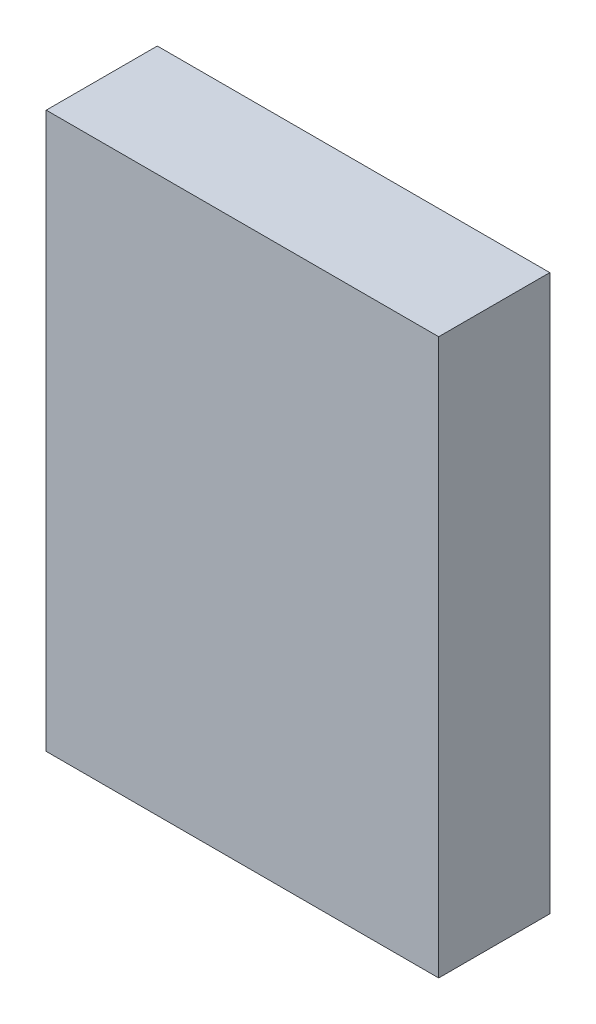
ISO-10303-21;
HEADER;
FILE_DESCRIPTION(('STEP AP214'),'2;1');
FILE_NAME('part.step','',(''),(''),'','','');
FILE_SCHEMA(('AUTOMOTIVE_DESIGN { 1 0 10303 214 1 1 1 1 }'));
ENDSEC;
DATA;
#1=APPLICATION_CONTEXT('core data for automotive mechanical design processes');
#2=APPLICATION_PROTOCOL_DEFINITION('international standard','automotive_design',2000,#1);
#3=PRODUCT_CONTEXT('',#1,'mechanical');
#4=PRODUCT('Part','Part','',(#3));
#5=PRODUCT_RELATED_PRODUCT_CATEGORY('part','',(#4));
#6=PRODUCT_DEFINITION_FORMATION('','',#4);
#7=PRODUCT_DEFINITION_CONTEXT('part definition',#1,'design');
#8=PRODUCT_DEFINITION('design','',#6,#7);
#9=PRODUCT_DEFINITION_SHAPE('','',#8);
#10=(LENGTH_UNIT() NAMED_UNIT(*) SI_UNIT(.MILLI.,.METRE.));
#11=(NAMED_UNIT(*) PLANE_ANGLE_UNIT() SI_UNIT($,.RADIAN.));
#12=(NAMED_UNIT(*) SI_UNIT($,.STERADIAN.) SOLID_ANGLE_UNIT());
#13=UNCERTAINTY_MEASURE_WITH_UNIT(LENGTH_MEASURE(1.E-05),#10,'distance_accuracy_value','');
#14=(GEOMETRIC_REPRESENTATION_CONTEXT(3) GLOBAL_UNCERTAINTY_ASSIGNED_CONTEXT((#13)) GLOBAL_UNIT_ASSIGNED_CONTEXT((#10,
#11,#12)) REPRESENTATION_CONTEXT('',''));
#15=CARTESIAN_POINT('',(0.,0.,0.));
#16=DIRECTION('',(0.,0.,1.));
#17=DIRECTION('',(1.,0.,0.));
#18=AXIS2_PLACEMENT_3D('',#15,#16,#17);
#19=CARTESIAN_POINT('',(0.,0.,15.));
#20=DIRECTION('',(1.,0.,0.));
#21=DIRECTION('',(0.,0.,-1.));
#22=AXIS2_PLACEMENT_3D('',#19,#20,#21);
#23=PLANE('',#22);
#24=DIRECTION('',(0.,-1.,0.));
#25=VECTOR('',#24,1.);
#26=CARTESIAN_POINT('',(0.,0.,0.));
#27=LINE('',#26,#25);
#28=CARTESIAN_POINT('',(0.,75.,0.));
#29=VERTEX_POINT('',#28);
#30=CARTESIAN_POINT('',(0.,0.,0.));
#31=VERTEX_POINT('',#30);
#32=EDGE_CURVE('E107',#29,#31,#27,.T.);
#33=ORIENTED_EDGE('',*,*,#32,.T.);
#34=DIRECTION('',(0.,0.,-1.));
#35=VECTOR('',#34,1.);
#36=CARTESIAN_POINT('',(0.,0.,15.));
#37=LINE('',#36,#35);
#38=CARTESIAN_POINT('',(0.,0.,15.));
#39=VERTEX_POINT('',#38);
#40=EDGE_CURVE('E11',#39,#31,#37,.T.);
#41=ORIENTED_EDGE('',*,*,#40,.F.);
#42=DIRECTION('',(0.,-1.,0.));
#43=VECTOR('',#42,1.);
#44=CARTESIAN_POINT('',(0.,0.,15.));
#45=LINE('',#44,#43);
#46=CARTESIAN_POINT('',(0.,75.,15.));
#47=VERTEX_POINT('',#46);
#48=EDGE_CURVE('E91',#47,#39,#45,.T.);
#49=ORIENTED_EDGE('',*,*,#48,.F.);
#50=DIRECTION('',(0.,0.,-1.));
#51=VECTOR('',#50,1.);
#52=CARTESIAN_POINT('',(0.,75.,15.));
#53=LINE('',#52,#51);
#54=EDGE_CURVE('E103',#47,#29,#53,.T.);
#55=ORIENTED_EDGE('',*,*,#54,.T.);
#56=EDGE_LOOP('',(#33,#41,#49,#55));
#57=FACE_BOUND('',#56,.T.);
#58=ADVANCED_FACE('F39',(#57),#23,.F.);
#59=CARTESIAN_POINT('',(0.,0.,15.));
#60=DIRECTION('',(0.,1.,0.));
#61=DIRECTION('',(0.,0.,1.));
#62=AXIS2_PLACEMENT_3D('',#59,#60,#61);
#63=PLANE('',#62);
#64=DIRECTION('',(1.,0.,0.));
#65=VECTOR('',#64,1.);
#66=CARTESIAN_POINT('',(0.,0.,0.));
#67=LINE('',#66,#65);
#68=CARTESIAN_POINT('',(53.,0.,0.));
#69=VERTEX_POINT('',#68);
#70=EDGE_CURVE('E96',#31,#69,#67,.T.);
#71=ORIENTED_EDGE('',*,*,#70,.T.);
#72=DIRECTION('',(0.,0.,-1.));
#73=VECTOR('',#72,1.);
#74=CARTESIAN_POINT('',(53.,0.,15.));
#75=LINE('',#74,#73);
#76=CARTESIAN_POINT('',(53.,0.,15.));
#77=VERTEX_POINT('',#76);
#78=EDGE_CURVE('E48',#77,#69,#75,.T.);
#79=ORIENTED_EDGE('',*,*,#78,.F.);
#80=DIRECTION('',(1.,0.,0.));
#81=VECTOR('',#80,1.);
#82=CARTESIAN_POINT('',(0.,0.,15.));
#83=LINE('',#82,#81);
#84=EDGE_CURVE('E86',#39,#77,#83,.T.);
#85=ORIENTED_EDGE('',*,*,#84,.F.);
#86=ORIENTED_EDGE('',*,*,#40,.T.);
#87=EDGE_LOOP('',(#71,#79,#85,#86));
#88=FACE_BOUND('',#87,.T.);
#89=ADVANCED_FACE('F95',(#88),#63,.F.);
#90=CARTESIAN_POINT('',(53.,0.,15.));
#91=DIRECTION('',(-1.,0.,0.));
#92=DIRECTION('',(0.,0.,1.));
#93=AXIS2_PLACEMENT_3D('',#90,#91,#92);
#94=PLANE('',#93);
#95=DIRECTION('',(0.,1.,0.));
#96=VECTOR('',#95,1.);
#97=CARTESIAN_POINT('',(53.,0.,0.));
#98=LINE('',#97,#96);
#99=CARTESIAN_POINT('',(53.,75.,0.));
#100=VERTEX_POINT('',#99);
#101=EDGE_CURVE('E73',#69,#100,#98,.T.);
#102=ORIENTED_EDGE('',*,*,#101,.T.);
#103=DIRECTION('',(0.,0.,-1.));
#104=VECTOR('',#103,1.);
#105=CARTESIAN_POINT('',(53.,75.,15.));
#106=LINE('',#105,#104);
#107=CARTESIAN_POINT('',(53.,75.,15.));
#108=VERTEX_POINT('',#107);
#109=EDGE_CURVE('E98',#108,#100,#106,.T.);
#110=ORIENTED_EDGE('',*,*,#109,.F.);
#111=DIRECTION('',(0.,1.,0.));
#112=VECTOR('',#111,1.);
#113=CARTESIAN_POINT('',(53.,0.,15.));
#114=LINE('',#113,#112);
#115=EDGE_CURVE('E89',#77,#108,#114,.T.);
#116=ORIENTED_EDGE('',*,*,#115,.F.);
#117=ORIENTED_EDGE('',*,*,#78,.T.);
#118=EDGE_LOOP('',(#102,#110,#116,#117));
#119=FACE_BOUND('',#118,.T.);
#120=ADVANCED_FACE('F99',(#119),#94,.F.);
#121=CARTESIAN_POINT('',(0.,75.,15.));
#122=DIRECTION('',(0.,-1.,0.));
#123=DIRECTION('',(0.,0.,-1.));
#124=AXIS2_PLACEMENT_3D('',#121,#122,#123);
#125=PLANE('',#124);
#126=DIRECTION('',(-1.,0.,0.));
#127=VECTOR('',#126,1.);
#128=CARTESIAN_POINT('',(0.,75.,0.));
#129=LINE('',#128,#127);
#130=EDGE_CURVE('E79',#100,#29,#129,.T.);
#131=ORIENTED_EDGE('',*,*,#130,.T.);
#132=ORIENTED_EDGE('',*,*,#54,.F.);
#133=DIRECTION('',(-1.,0.,0.));
#134=VECTOR('',#133,1.);
#135=CARTESIAN_POINT('',(0.,75.,15.));
#136=LINE('',#135,#134);
#137=EDGE_CURVE('E56',#108,#47,#136,.T.);
#138=ORIENTED_EDGE('',*,*,#137,.F.);
#139=ORIENTED_EDGE('',*,*,#109,.T.);
#140=EDGE_LOOP('',(#131,#132,#138,#139));
#141=FACE_BOUND('',#140,.T.);
#142=ADVANCED_FACE('F120',(#141),#125,.F.);
#143=CARTESIAN_POINT('',(0.,0.,15.));
#144=DIRECTION('',(0.,0.,-1.));
#145=DIRECTION('',(-1.,0.,0.));
#146=AXIS2_PLACEMENT_3D('',#143,#144,#145);
#147=PLANE('',#146);
#148=ORIENTED_EDGE('',*,*,#48,.T.);
#149=ORIENTED_EDGE('',*,*,#84,.T.);
#150=ORIENTED_EDGE('',*,*,#115,.T.);
#151=ORIENTED_EDGE('',*,*,#137,.T.);
#152=EDGE_LOOP('',(#148,#149,#150,#151));
#153=FACE_BOUND('',#152,.T.);
#154=ADVANCED_FACE('F87',(#153),#147,.F.);
#155=CARTESIAN_POINT('',(0.,0.,0.));
#156=DIRECTION('',(0.,0.,-1.));
#157=DIRECTION('',(-1.,0.,0.));
#158=AXIS2_PLACEMENT_3D('',#155,#156,#157);
#159=PLANE('',#158);
#160=ORIENTED_EDGE('',*,*,#32,.F.);
#161=ORIENTED_EDGE('',*,*,#130,.F.);
#162=ORIENTED_EDGE('',*,*,#101,.F.);
#163=ORIENTED_EDGE('',*,*,#70,.F.);
#164=EDGE_LOOP('',(#160,#161,#162,#163));
#165=FACE_BOUND('',#164,.T.);
#166=ADVANCED_FACE('F123',(#165),#159,.T.);
#167=CLOSED_SHELL('',(#58,#89,#120,#142,#154,#166));
#168=MANIFOLD_SOLID_BREP('B2',#167);
#169=ADVANCED_BREP_SHAPE_REPRESENTATION('',(#18,#168),#14);
#170=SHAPE_DEFINITION_REPRESENTATION(#9,#169);
ENDSEC;
END-ISO-10303-21;
